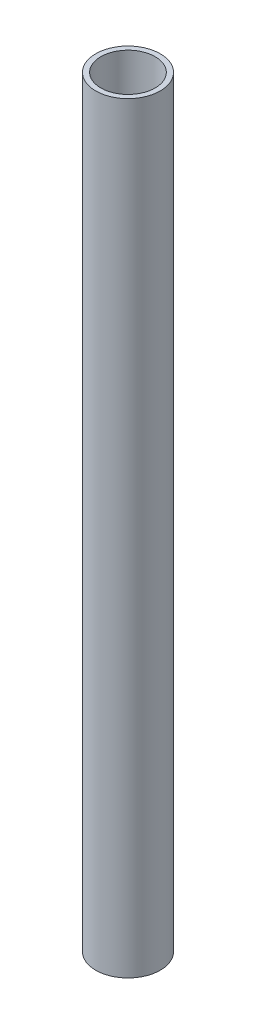
ISO-10303-21;
HEADER;
FILE_DESCRIPTION(('STEP AP214'),'2;1');
FILE_NAME('part.step','',(''),(''),'','','');
FILE_SCHEMA(('AUTOMOTIVE_DESIGN { 1 0 10303 214 1 1 1 1 }'));
ENDSEC;
DATA;
#1=APPLICATION_CONTEXT('core data for automotive mechanical design processes');
#2=APPLICATION_PROTOCOL_DEFINITION('international standard','automotive_design',2000,#1);
#3=PRODUCT_CONTEXT('',#1,'mechanical');
#4=PRODUCT('Part','Part','',(#3));
#5=PRODUCT_RELATED_PRODUCT_CATEGORY('part','',(#4));
#6=PRODUCT_DEFINITION_FORMATION('','',#4);
#7=PRODUCT_DEFINITION_CONTEXT('part definition',#1,'design');
#8=PRODUCT_DEFINITION('design','',#6,#7);
#9=PRODUCT_DEFINITION_SHAPE('','',#8);
#10=(LENGTH_UNIT() NAMED_UNIT(*) SI_UNIT(.MILLI.,.METRE.));
#11=(NAMED_UNIT(*) PLANE_ANGLE_UNIT() SI_UNIT($,.RADIAN.));
#12=(NAMED_UNIT(*) SI_UNIT($,.STERADIAN.) SOLID_ANGLE_UNIT());
#13=UNCERTAINTY_MEASURE_WITH_UNIT(LENGTH_MEASURE(1.E-05),#10,'distance_accuracy_value','');
#14=(GEOMETRIC_REPRESENTATION_CONTEXT(3) GLOBAL_UNCERTAINTY_ASSIGNED_CONTEXT((#13)) GLOBAL_UNIT_ASSIGNED_CONTEXT((#10,
#11,#12)) REPRESENTATION_CONTEXT('',''));
#15=CARTESIAN_POINT('',(0.,0.,0.));
#16=DIRECTION('',(0.,0.,1.));
#17=DIRECTION('',(1.,0.,0.));
#18=AXIS2_PLACEMENT_3D('',#15,#16,#17);
#19=CARTESIAN_POINT('',(0.,300.,0.));
#20=DIRECTION('',(0.,1.,0.));
#21=DIRECTION('',(0.,0.,1.));
#22=AXIS2_PLACEMENT_3D('',#19,#20,#21);
#23=PLANE('',#22);
#24=CARTESIAN_POINT('',(0.,300.,0.));
#25=DIRECTION('',(0.,1.,0.));
#26=DIRECTION('',(0.,0.,1.));
#27=AXIS2_PLACEMENT_3D('',#24,#25,#26);
#28=CIRCLE('',#27,12.7);
#29=CARTESIAN_POINT('',(0.,300.,12.7));
#30=VERTEX_POINT('',#29);
#31=EDGE_CURVE('E10',#30,#30,#28,.T.);
#32=ORIENTED_EDGE('',*,*,#31,.T.);
#33=EDGE_LOOP('',(#32));
#34=FACE_BOUND('',#33,.T.);
#35=CARTESIAN_POINT('',(0.,300.,0.));
#36=DIRECTION('',(0.,1.,0.));
#37=DIRECTION('',(0.,0.,1.));
#38=AXIS2_PLACEMENT_3D('',#35,#36,#37);
#39=CIRCLE('',#38,10.7);
#40=CARTESIAN_POINT('',(0.,300.,10.7));
#41=VERTEX_POINT('',#40);
#42=EDGE_CURVE('E42',#41,#41,#39,.T.);
#43=ORIENTED_EDGE('',*,*,#42,.F.);
#44=EDGE_LOOP('',(#43));
#45=FACE_BOUND('',#44,.T.);
#46=ADVANCED_FACE('F31',(#34,#45),#23,.T.);
#47=CARTESIAN_POINT('',(0.,0.,0.));
#48=DIRECTION('',(0.,1.,0.));
#49=DIRECTION('',(0.,0.,1.));
#50=AXIS2_PLACEMENT_3D('',#47,#48,#49);
#51=PLANE('',#50);
#52=CARTESIAN_POINT('',(0.,0.,0.));
#53=DIRECTION('',(0.,1.,0.));
#54=DIRECTION('',(0.,0.,1.));
#55=AXIS2_PLACEMENT_3D('',#52,#53,#54);
#56=CIRCLE('',#55,12.7);
#57=CARTESIAN_POINT('',(0.,0.,12.7));
#58=VERTEX_POINT('',#57);
#59=EDGE_CURVE('E35',#58,#58,#56,.T.);
#60=ORIENTED_EDGE('',*,*,#59,.F.);
#61=EDGE_LOOP('',(#60));
#62=FACE_BOUND('',#61,.T.);
#63=CARTESIAN_POINT('',(0.,0.,0.));
#64=DIRECTION('',(0.,1.,0.));
#65=DIRECTION('',(0.,0.,1.));
#66=AXIS2_PLACEMENT_3D('',#63,#64,#65);
#67=CIRCLE('',#66,10.7);
#68=CARTESIAN_POINT('',(0.,0.,10.7));
#69=VERTEX_POINT('',#68);
#70=EDGE_CURVE('E44',#69,#69,#67,.T.);
#71=ORIENTED_EDGE('',*,*,#70,.T.);
#72=EDGE_LOOP('',(#71));
#73=FACE_BOUND('',#72,.T.);
#74=ADVANCED_FACE('F54',(#62,#73),#51,.F.);
#75=CARTESIAN_POINT('',(0.,300.,0.));
#76=DIRECTION('',(0.,-1.,0.));
#77=DIRECTION('',(0.,0.,-1.));
#78=AXIS2_PLACEMENT_3D('',#75,#76,#77);
#79=CYLINDRICAL_SURFACE('',#78,12.7);
#80=ORIENTED_EDGE('',*,*,#31,.F.);
#81=EDGE_LOOP('',(#80));
#82=FACE_BOUND('',#81,.T.);
#83=ORIENTED_EDGE('',*,*,#59,.T.);
#84=EDGE_LOOP('',(#83));
#85=FACE_BOUND('',#84,.T.);
#86=ADVANCED_FACE('F33',(#82,#85),#79,.T.);
#87=CARTESIAN_POINT('',(0.,300.,0.));
#88=DIRECTION('',(0.,-1.,0.));
#89=DIRECTION('',(0.,0.,-1.));
#90=AXIS2_PLACEMENT_3D('',#87,#88,#89);
#91=CYLINDRICAL_SURFACE('',#90,10.7);
#92=ORIENTED_EDGE('',*,*,#42,.T.);
#93=EDGE_LOOP('',(#92));
#94=FACE_BOUND('',#93,.T.);
#95=ORIENTED_EDGE('',*,*,#70,.F.);
#96=EDGE_LOOP('',(#95));
#97=FACE_BOUND('',#96,.T.);
#98=ADVANCED_FACE('F50',(#94,#97),#91,.F.);
#99=CLOSED_SHELL('',(#46,#74,#86,#98));
#100=MANIFOLD_SOLID_BREP('B2',#99);
#101=ADVANCED_BREP_SHAPE_REPRESENTATION('',(#18,#100),#14);
#102=SHAPE_DEFINITION_REPRESENTATION(#9,#101);
ENDSEC;
END-ISO-10303-21;
